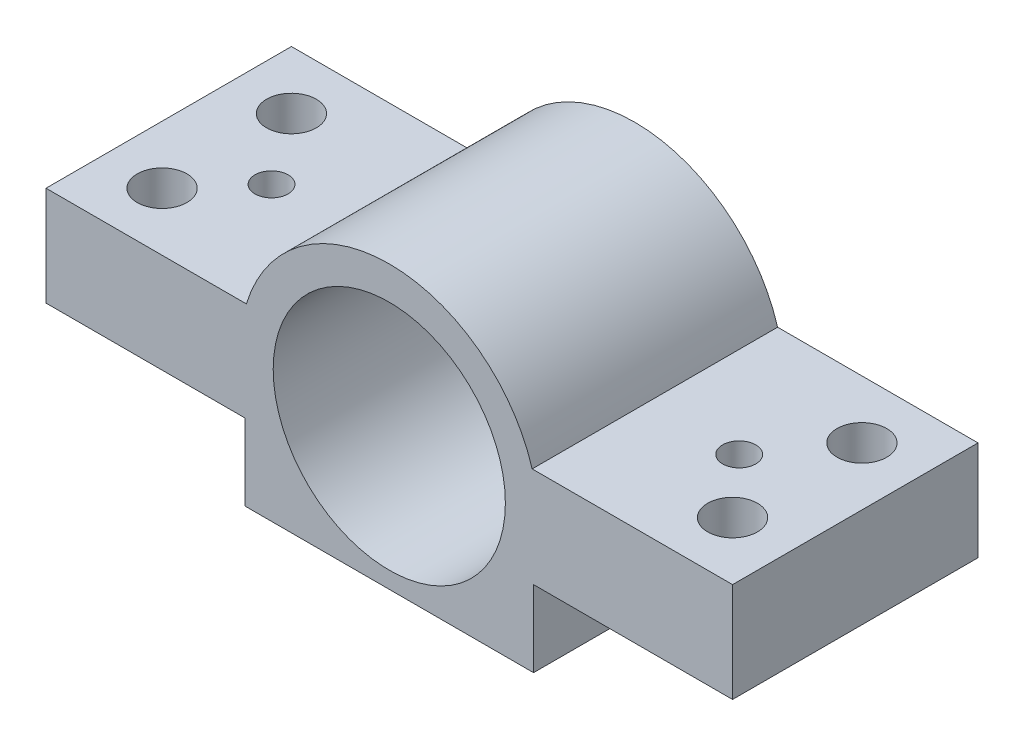
ISO-10303-21;
HEADER;
FILE_DESCRIPTION(('STEP AP214'),'2;1');
FILE_NAME('part.step','',(''),(''),'','','');
FILE_SCHEMA(('AUTOMOTIVE_DESIGN { 1 0 10303 214 1 1 1 1 }'));
ENDSEC;
DATA;
#1=APPLICATION_CONTEXT('core data for automotive mechanical design processes');
#2=APPLICATION_PROTOCOL_DEFINITION('international standard','automotive_design',2000,#1);
#3=PRODUCT_CONTEXT('',#1,'mechanical');
#4=PRODUCT('Part','Part','',(#3));
#5=PRODUCT_RELATED_PRODUCT_CATEGORY('part','',(#4));
#6=PRODUCT_DEFINITION_FORMATION('','',#4);
#7=PRODUCT_DEFINITION_CONTEXT('part definition',#1,'design');
#8=PRODUCT_DEFINITION('design','',#6,#7);
#9=PRODUCT_DEFINITION_SHAPE('','',#8);
#10=(LENGTH_UNIT() NAMED_UNIT(*) SI_UNIT(.MILLI.,.METRE.));
#11=(NAMED_UNIT(*) PLANE_ANGLE_UNIT() SI_UNIT($,.RADIAN.));
#12=(NAMED_UNIT(*) SI_UNIT($,.STERADIAN.) SOLID_ANGLE_UNIT());
#13=UNCERTAINTY_MEASURE_WITH_UNIT(LENGTH_MEASURE(1.E-05),#10,'distance_accuracy_value','');
#14=(GEOMETRIC_REPRESENTATION_CONTEXT(3) GLOBAL_UNCERTAINTY_ASSIGNED_CONTEXT((#13)) GLOBAL_UNIT_ASSIGNED_CONTEXT((#10,
#11,#12)) REPRESENTATION_CONTEXT('',''));
#15=CARTESIAN_POINT('',(0.,0.,0.));
#16=DIRECTION('',(0.,0.,1.));
#17=DIRECTION('',(1.,0.,0.));
#18=AXIS2_PLACEMENT_3D('',#15,#16,#17);
#19=CARTESIAN_POINT('',(0.,40.,74.));
#20=DIRECTION('',(0.,0.,-1.));
#21=DIRECTION('',(-1.,0.,0.));
#22=AXIS2_PLACEMENT_3D('',#19,#20,#21);
#23=CYLINDRICAL_SURFACE('',#22,35.);
#24=CARTESIAN_POINT('',(0.,40.,74.));
#25=DIRECTION('',(0.,0.,1.));
#26=DIRECTION('',(1.,0.,0.));
#27=AXIS2_PLACEMENT_3D('',#24,#25,#26);
#28=CIRCLE('',#27,35.);
#29=CARTESIAN_POINT('',(35.,40.,74.));
#30=VERTEX_POINT('',#29);
#31=EDGE_CURVE('E154',#30,#30,#28,.T.);
#32=ORIENTED_EDGE('',*,*,#31,.T.);
#33=EDGE_LOOP('',(#32));
#34=FACE_BOUND('',#33,.T.);
#35=CARTESIAN_POINT('',(0.,40.,13.));
#36=DIRECTION('',(0.,0.,-1.));
#37=DIRECTION('',(-1.,0.,0.));
#38=AXIS2_PLACEMENT_3D('',#35,#36,#37);
#39=CIRCLE('',#38,35.);
#40=CARTESIAN_POINT('',(-35.,40.,13.));
#41=VERTEX_POINT('',#40);
#42=EDGE_CURVE('E219',#41,#41,#39,.T.);
#43=ORIENTED_EDGE('',*,*,#42,.T.);
#44=EDGE_LOOP('',(#43));
#45=FACE_BOUND('',#44,.T.);
#46=ADVANCED_FACE('F40',(#34,#45),#23,.F.);
#47=CARTESIAN_POINT('',(0.,40.,74.));
#48=DIRECTION('',(0.,0.,1.));
#49=DIRECTION('',(1.,0.,0.));
#50=AXIS2_PLACEMENT_3D('',#47,#48,#49);
#51=PLANE('',#50);
#52=DIRECTION('',(-1.,0.,0.));
#53=VECTOR('',#52,1.);
#54=CARTESIAN_POINT('',(103.5,53.,74.));
#55=LINE('',#54,#53);
#56=CARTESIAN_POINT('',(103.5,53.,74.));
#57=VERTEX_POINT('',#56);
#58=CARTESIAN_POINT('',(43.081318457076,53.,74.));
#59=VERTEX_POINT('',#58);
#60=EDGE_CURVE('E169',#57,#59,#55,.T.);
#61=ORIENTED_EDGE('',*,*,#60,.T.);
#62=CARTESIAN_POINT('',(0.,40.,74.));
#63=DIRECTION('',(0.,0.,1.));
#64=DIRECTION('',(1.,0.,0.));
#65=AXIS2_PLACEMENT_3D('',#62,#63,#64);
#66=CIRCLE('',#65,45.);
#67=CARTESIAN_POINT('',(-43.081318457076,53.,74.));
#68=VERTEX_POINT('',#67);
#69=EDGE_CURVE('E106',#59,#68,#66,.T.);
#70=ORIENTED_EDGE('',*,*,#69,.T.);
#71=DIRECTION('',(-1.,0.,0.));
#72=VECTOR('',#71,1.);
#73=CARTESIAN_POINT('',(-103.5,53.,74.));
#74=LINE('',#73,#72);
#75=CARTESIAN_POINT('',(-103.5,53.,74.));
#76=VERTEX_POINT('',#75);
#77=EDGE_CURVE('E190',#68,#76,#74,.T.);
#78=ORIENTED_EDGE('',*,*,#77,.T.);
#79=DIRECTION('',(0.,-1.,0.));
#80=VECTOR('',#79,1.);
#81=CARTESIAN_POINT('',(-103.5,23.,74.));
#82=LINE('',#81,#80);
#83=CARTESIAN_POINT('',(-103.5,23.,74.));
#84=VERTEX_POINT('',#83);
#85=EDGE_CURVE('E209',#76,#84,#82,.T.);
#86=ORIENTED_EDGE('',*,*,#85,.T.);
#87=DIRECTION('',(1.,0.,0.));
#88=VECTOR('',#87,1.);
#89=CARTESIAN_POINT('',(-43.5,23.,74.));
#90=LINE('',#89,#88);
#91=CARTESIAN_POINT('',(-43.5,23.,74.));
#92=VERTEX_POINT('',#91);
#93=EDGE_CURVE('E206',#84,#92,#90,.T.);
#94=ORIENTED_EDGE('',*,*,#93,.T.);
#95=DIRECTION('',(0.,-1.,0.));
#96=VECTOR('',#95,1.);
#97=CARTESIAN_POINT('',(-43.5,0.,74.));
#98=LINE('',#97,#96);
#99=CARTESIAN_POINT('',(-43.5,0.,74.));
#100=VERTEX_POINT('',#99);
#101=EDGE_CURVE('E208',#92,#100,#98,.T.);
#102=ORIENTED_EDGE('',*,*,#101,.T.);
#103=DIRECTION('',(1.,0.,0.));
#104=VECTOR('',#103,1.);
#105=CARTESIAN_POINT('',(-43.5,0.,74.));
#106=LINE('',#105,#104);
#107=CARTESIAN_POINT('',(43.5,0.,74.));
#108=VERTEX_POINT('',#107);
#109=EDGE_CURVE('E132',#100,#108,#106,.T.);
#110=ORIENTED_EDGE('',*,*,#109,.T.);
#111=DIRECTION('',(0.,1.,0.));
#112=VECTOR('',#111,1.);
#113=CARTESIAN_POINT('',(43.5,0.,74.));
#114=LINE('',#113,#112);
#115=CARTESIAN_POINT('',(43.5,23.,74.));
#116=VERTEX_POINT('',#115);
#117=EDGE_CURVE('E125',#108,#116,#114,.T.);
#118=ORIENTED_EDGE('',*,*,#117,.T.);
#119=DIRECTION('',(1.,0.,0.));
#120=VECTOR('',#119,1.);
#121=CARTESIAN_POINT('',(43.5,23.,74.));
#122=LINE('',#121,#120);
#123=CARTESIAN_POINT('',(103.5,23.,74.));
#124=VERTEX_POINT('',#123);
#125=EDGE_CURVE('E130',#116,#124,#122,.T.);
#126=ORIENTED_EDGE('',*,*,#125,.T.);
#127=DIRECTION('',(0.,1.,0.));
#128=VECTOR('',#127,1.);
#129=CARTESIAN_POINT('',(103.5,23.,74.));
#130=LINE('',#129,#128);
#131=EDGE_CURVE('E57',#124,#57,#130,.T.);
#132=ORIENTED_EDGE('',*,*,#131,.T.);
#133=EDGE_LOOP('',(#61,#70,#78,#86,#94,#102,#110,#118,#126,#132));
#134=FACE_BOUND('',#133,.T.);
#135=ORIENTED_EDGE('',*,*,#31,.F.);
#136=EDGE_LOOP('',(#135));
#137=FACE_BOUND('',#136,.T.);
#138=ADVANCED_FACE('F127',(#134,#137),#51,.T.);
#139=CARTESIAN_POINT('',(0.,40.,0.));
#140=DIRECTION('',(0.,0.,1.));
#141=DIRECTION('',(1.,0.,0.));
#142=AXIS2_PLACEMENT_3D('',#139,#140,#141);
#143=PLANE('',#142);
#144=DIRECTION('',(-1.,0.,0.));
#145=VECTOR('',#144,1.);
#146=CARTESIAN_POINT('',(103.5,53.,0.));
#147=LINE('',#146,#145);
#148=CARTESIAN_POINT('',(103.5,53.,0.));
#149=VERTEX_POINT('',#148);
#150=CARTESIAN_POINT('',(43.081318457076,53.,0.));
#151=VERTEX_POINT('',#150);
#152=EDGE_CURVE('E150',#149,#151,#147,.T.);
#153=ORIENTED_EDGE('',*,*,#152,.F.);
#154=DIRECTION('',(0.,1.,0.));
#155=VECTOR('',#154,1.);
#156=CARTESIAN_POINT('',(103.5,23.,0.));
#157=LINE('',#156,#155);
#158=CARTESIAN_POINT('',(103.5,23.,0.));
#159=VERTEX_POINT('',#158);
#160=EDGE_CURVE('E98',#159,#149,#157,.T.);
#161=ORIENTED_EDGE('',*,*,#160,.F.);
#162=DIRECTION('',(1.,0.,0.));
#163=VECTOR('',#162,1.);
#164=CARTESIAN_POINT('',(43.5,23.,0.));
#165=LINE('',#164,#163);
#166=CARTESIAN_POINT('',(43.5,23.,0.));
#167=VERTEX_POINT('',#166);
#168=EDGE_CURVE('E92',#167,#159,#165,.T.);
#169=ORIENTED_EDGE('',*,*,#168,.F.);
#170=DIRECTION('',(0.,1.,0.));
#171=VECTOR('',#170,1.);
#172=CARTESIAN_POINT('',(43.5,0.,0.));
#173=LINE('',#172,#171);
#174=CARTESIAN_POINT('',(43.5,0.,0.));
#175=VERTEX_POINT('',#174);
#176=EDGE_CURVE('E140',#175,#167,#173,.T.);
#177=ORIENTED_EDGE('',*,*,#176,.F.);
#178=DIRECTION('',(1.,0.,0.));
#179=VECTOR('',#178,1.);
#180=CARTESIAN_POINT('',(-43.5,0.,0.));
#181=LINE('',#180,#179);
#182=CARTESIAN_POINT('',(-43.5,0.,0.));
#183=VERTEX_POINT('',#182);
#184=EDGE_CURVE('E164',#183,#175,#181,.T.);
#185=ORIENTED_EDGE('',*,*,#184,.F.);
#186=DIRECTION('',(0.,-1.,0.));
#187=VECTOR('',#186,1.);
#188=CARTESIAN_POINT('',(-43.5,0.,0.));
#189=LINE('',#188,#187);
#190=CARTESIAN_POINT('',(-43.5,23.,0.));
#191=VERTEX_POINT('',#190);
#192=EDGE_CURVE('E162',#191,#183,#189,.T.);
#193=ORIENTED_EDGE('',*,*,#192,.F.);
#194=DIRECTION('',(1.,0.,0.));
#195=VECTOR('',#194,1.);
#196=CARTESIAN_POINT('',(-43.5,23.,0.));
#197=LINE('',#196,#195);
#198=CARTESIAN_POINT('',(-103.5,23.,0.));
#199=VERTEX_POINT('',#198);
#200=EDGE_CURVE('E160',#199,#191,#197,.T.);
#201=ORIENTED_EDGE('',*,*,#200,.F.);
#202=DIRECTION('',(0.,-1.,0.));
#203=VECTOR('',#202,1.);
#204=CARTESIAN_POINT('',(-103.5,23.,0.));
#205=LINE('',#204,#203);
#206=CARTESIAN_POINT('',(-103.5,53.,0.));
#207=VERTEX_POINT('',#206);
#208=EDGE_CURVE('E158',#207,#199,#205,.T.);
#209=ORIENTED_EDGE('',*,*,#208,.F.);
#210=DIRECTION('',(-1.,0.,0.));
#211=VECTOR('',#210,1.);
#212=CARTESIAN_POINT('',(-103.5,53.,0.));
#213=LINE('',#212,#211);
#214=CARTESIAN_POINT('',(-43.081318457076,53.,0.));
#215=VERTEX_POINT('',#214);
#216=EDGE_CURVE('E156',#215,#207,#213,.T.);
#217=ORIENTED_EDGE('',*,*,#216,.F.);
#218=CARTESIAN_POINT('',(0.,40.,0.));
#219=DIRECTION('',(0.,0.,1.));
#220=DIRECTION('',(1.,0.,0.));
#221=AXIS2_PLACEMENT_3D('',#218,#219,#220);
#222=CIRCLE('',#221,45.);
#223=EDGE_CURVE('E153',#151,#215,#222,.T.);
#224=ORIENTED_EDGE('',*,*,#223,.F.);
#225=EDGE_LOOP('',(#153,#161,#169,#177,#185,#193,#201,#209,#217,#224));
#226=FACE_BOUND('',#225,.T.);
#227=CARTESIAN_POINT('',(0.,40.,0.));
#228=DIRECTION('',(0.,0.,-1.));
#229=DIRECTION('',(-1.,0.,0.));
#230=AXIS2_PLACEMENT_3D('',#227,#228,#229);
#231=CIRCLE('',#230,21.);
#232=CARTESIAN_POINT('',(-21.,40.,0.));
#233=VERTEX_POINT('',#232);
#234=EDGE_CURVE('E223',#233,#233,#231,.T.);
#235=ORIENTED_EDGE('',*,*,#234,.F.);
#236=EDGE_LOOP('',(#235));
#237=FACE_BOUND('',#236,.T.);
#238=ADVANCED_FACE('F194',(#226,#237),#143,.F.);
#239=CARTESIAN_POINT('',(103.5,53.,74.));
#240=DIRECTION('',(0.,-1.,0.));
#241=DIRECTION('',(0.,0.,-1.));
#242=AXIS2_PLACEMENT_3D('',#239,#240,#241);
#243=PLANE('',#242);
#244=CARTESIAN_POINT('',(86.,53.,56.5000000000002));
#245=DIRECTION('',(0.,-1.,0.));
#246=DIRECTION('',(0.,0.,-1.));
#247=AXIS2_PLACEMENT_3D('',#244,#245,#246);
#248=CIRCLE('',#247,7.49999999999993);
#249=CARTESIAN_POINT('',(86.,53.,49.0000000000003));
#250=VERTEX_POINT('',#249);
#251=EDGE_CURVE('E238',#250,#250,#248,.F.);
#252=ORIENTED_EDGE('',*,*,#251,.F.);
#253=EDGE_LOOP('',(#252));
#254=FACE_BOUND('',#253,.T.);
#255=CARTESIAN_POINT('',(70.5,53.,39.0000000000001));
#256=DIRECTION('',(0.,-1.,0.));
#257=DIRECTION('',(0.,0.,-1.));
#258=AXIS2_PLACEMENT_3D('',#255,#256,#257);
#259=CIRCLE('',#258,4.99999999999983);
#260=CARTESIAN_POINT('',(70.5,53.,34.0000000000003));
#261=VERTEX_POINT('',#260);
#262=EDGE_CURVE('E239',#261,#261,#259,.F.);
#263=ORIENTED_EDGE('',*,*,#262,.F.);
#264=EDGE_LOOP('',(#263));
#265=FACE_BOUND('',#264,.T.);
#266=CARTESIAN_POINT('',(86.,53.,17.5000000000001));
#267=DIRECTION('',(0.,-1.,0.));
#268=DIRECTION('',(0.,0.,-1.));
#269=AXIS2_PLACEMENT_3D('',#266,#267,#268);
#270=CIRCLE('',#269,7.49999999999981);
#271=CARTESIAN_POINT('',(86.,53.,10.0000000000003));
#272=VERTEX_POINT('',#271);
#273=EDGE_CURVE('E261',#272,#272,#270,.F.);
#274=ORIENTED_EDGE('',*,*,#273,.F.);
#275=EDGE_LOOP('',(#274));
#276=FACE_BOUND('',#275,.T.);
#277=ORIENTED_EDGE('',*,*,#152,.T.);
#278=DIRECTION('',(0.,0.,-1.));
#279=VECTOR('',#278,1.);
#280=CARTESIAN_POINT('',(43.081318457076,53.,74.));
#281=LINE('',#280,#279);
#282=EDGE_CURVE('E11',#59,#151,#281,.T.);
#283=ORIENTED_EDGE('',*,*,#282,.F.);
#284=ORIENTED_EDGE('',*,*,#60,.F.);
#285=DIRECTION('',(0.,0.,-1.));
#286=VECTOR('',#285,1.);
#287=CARTESIAN_POINT('',(103.5,53.,74.));
#288=LINE('',#287,#286);
#289=EDGE_CURVE('E146',#57,#149,#288,.T.);
#290=ORIENTED_EDGE('',*,*,#289,.T.);
#291=EDGE_LOOP('',(#277,#283,#284,#290));
#292=FACE_BOUND('',#291,.T.);
#293=ADVANCED_FACE('F42',(#254,#265,#276,#292),#243,.F.);
#294=CARTESIAN_POINT('',(0.,40.,74.));
#295=DIRECTION('',(0.,0.,-1.));
#296=DIRECTION('',(-1.,0.,0.));
#297=AXIS2_PLACEMENT_3D('',#294,#295,#296);
#298=CYLINDRICAL_SURFACE('',#297,45.);
#299=ORIENTED_EDGE('',*,*,#223,.T.);
#300=DIRECTION('',(0.,0.,-1.));
#301=VECTOR('',#300,1.);
#302=CARTESIAN_POINT('',(-43.081318457076,53.,74.));
#303=LINE('',#302,#301);
#304=EDGE_CURVE('E49',#68,#215,#303,.T.);
#305=ORIENTED_EDGE('',*,*,#304,.F.);
#306=ORIENTED_EDGE('',*,*,#69,.F.);
#307=ORIENTED_EDGE('',*,*,#282,.T.);
#308=EDGE_LOOP('',(#299,#305,#306,#307));
#309=FACE_BOUND('',#308,.T.);
#310=ADVANCED_FACE('F270',(#309),#298,.T.);
#311=CARTESIAN_POINT('',(-103.5,53.,74.));
#312=DIRECTION('',(0.,-1.,0.));
#313=DIRECTION('',(0.,0.,-1.));
#314=AXIS2_PLACEMENT_3D('',#311,#312,#313);
#315=PLANE('',#314);
#316=CARTESIAN_POINT('',(-70.5,53.,39.0000000000001));
#317=DIRECTION('',(0.,-1.,0.));
#318=DIRECTION('',(0.,0.,-1.));
#319=AXIS2_PLACEMENT_3D('',#316,#317,#318);
#320=CIRCLE('',#319,4.99999999999982);
#321=CARTESIAN_POINT('',(-70.5,53.,34.0000000000003));
#322=VERTEX_POINT('',#321);
#323=EDGE_CURVE('E252',#322,#322,#320,.F.);
#324=ORIENTED_EDGE('',*,*,#323,.F.);
#325=EDGE_LOOP('',(#324));
#326=FACE_BOUND('',#325,.T.);
#327=CARTESIAN_POINT('',(-86.,53.,17.5000000000001));
#328=DIRECTION('',(0.,-1.,0.));
#329=DIRECTION('',(0.,0.,-1.));
#330=AXIS2_PLACEMENT_3D('',#327,#328,#329);
#331=CIRCLE('',#330,7.49999999999988);
#332=CARTESIAN_POINT('',(-86.,53.,10.0000000000002));
#333=VERTEX_POINT('',#332);
#334=EDGE_CURVE('E246',#333,#333,#331,.F.);
#335=ORIENTED_EDGE('',*,*,#334,.F.);
#336=EDGE_LOOP('',(#335));
#337=FACE_BOUND('',#336,.T.);
#338=CARTESIAN_POINT('',(-86.,53.,56.5000000000002));
#339=DIRECTION('',(0.,-1.,0.));
#340=DIRECTION('',(0.,0.,-1.));
#341=AXIS2_PLACEMENT_3D('',#338,#339,#340);
#342=CIRCLE('',#341,7.49999999999988);
#343=CARTESIAN_POINT('',(-86.,53.,49.0000000000003));
#344=VERTEX_POINT('',#343);
#345=EDGE_CURVE('E226',#344,#344,#342,.F.);
#346=ORIENTED_EDGE('',*,*,#345,.F.);
#347=EDGE_LOOP('',(#346));
#348=FACE_BOUND('',#347,.T.);
#349=ORIENTED_EDGE('',*,*,#216,.T.);
#350=DIRECTION('',(0.,0.,-1.));
#351=VECTOR('',#350,1.);
#352=CARTESIAN_POINT('',(-103.5,53.,74.));
#353=LINE('',#352,#351);
#354=EDGE_CURVE('E182',#76,#207,#353,.T.);
#355=ORIENTED_EDGE('',*,*,#354,.F.);
#356=ORIENTED_EDGE('',*,*,#77,.F.);
#357=ORIENTED_EDGE('',*,*,#304,.T.);
#358=EDGE_LOOP('',(#349,#355,#356,#357));
#359=FACE_BOUND('',#358,.T.);
#360=ADVANCED_FACE('F188',(#326,#337,#348,#359),#315,.F.);
#361=CARTESIAN_POINT('',(-103.5,23.,74.));
#362=DIRECTION('',(1.,0.,0.));
#363=DIRECTION('',(0.,0.,-1.));
#364=AXIS2_PLACEMENT_3D('',#361,#362,#363);
#365=PLANE('',#364);
#366=ORIENTED_EDGE('',*,*,#208,.T.);
#367=DIRECTION('',(0.,0.,-1.));
#368=VECTOR('',#367,1.);
#369=CARTESIAN_POINT('',(-103.5,23.,74.));
#370=LINE('',#369,#368);
#371=EDGE_CURVE('E179',#84,#199,#370,.T.);
#372=ORIENTED_EDGE('',*,*,#371,.F.);
#373=ORIENTED_EDGE('',*,*,#85,.F.);
#374=ORIENTED_EDGE('',*,*,#354,.T.);
#375=EDGE_LOOP('',(#366,#372,#373,#374));
#376=FACE_BOUND('',#375,.T.);
#377=ADVANCED_FACE('F200',(#376),#365,.F.);
#378=CARTESIAN_POINT('',(-43.5,23.,74.));
#379=DIRECTION('',(0.,1.,0.));
#380=DIRECTION('',(-1.,0.,0.));
#381=AXIS2_PLACEMENT_3D('',#378,#379,#380);
#382=PLANE('',#381);
#383=CARTESIAN_POINT('',(-70.5,23.,39.0000000000001));
#384=DIRECTION('',(0.,-1.,0.));
#385=DIRECTION('',(0.,0.,-1.));
#386=AXIS2_PLACEMENT_3D('',#383,#384,#385);
#387=CIRCLE('',#386,4.99999999999982);
#388=CARTESIAN_POINT('',(-70.5,23.,34.0000000000003));
#389=VERTEX_POINT('',#388);
#390=EDGE_CURVE('E234',#389,#389,#387,.T.);
#391=ORIENTED_EDGE('',*,*,#390,.F.);
#392=EDGE_LOOP('',(#391));
#393=FACE_BOUND('',#392,.T.);
#394=CARTESIAN_POINT('',(-86.,23.,17.5000000000001));
#395=DIRECTION('',(0.,-1.,0.));
#396=DIRECTION('',(0.,0.,-1.));
#397=AXIS2_PLACEMENT_3D('',#394,#395,#396);
#398=CIRCLE('',#397,7.49999999999988);
#399=CARTESIAN_POINT('',(-86.,23.,10.0000000000002));
#400=VERTEX_POINT('',#399);
#401=EDGE_CURVE('E249',#400,#400,#398,.T.);
#402=ORIENTED_EDGE('',*,*,#401,.F.);
#403=EDGE_LOOP('',(#402));
#404=FACE_BOUND('',#403,.T.);
#405=CARTESIAN_POINT('',(-86.,23.,56.5000000000002));
#406=DIRECTION('',(0.,-1.,0.));
#407=DIRECTION('',(0.,0.,-1.));
#408=AXIS2_PLACEMENT_3D('',#405,#406,#407);
#409=CIRCLE('',#408,7.49999999999988);
#410=CARTESIAN_POINT('',(-86.,23.,49.0000000000003));
#411=VERTEX_POINT('',#410);
#412=EDGE_CURVE('E231',#411,#411,#409,.T.);
#413=ORIENTED_EDGE('',*,*,#412,.F.);
#414=EDGE_LOOP('',(#413));
#415=FACE_BOUND('',#414,.T.);
#416=ORIENTED_EDGE('',*,*,#200,.T.);
#417=DIRECTION('',(0.,0.,-1.));
#418=VECTOR('',#417,1.);
#419=CARTESIAN_POINT('',(-43.5,23.,74.));
#420=LINE('',#419,#418);
#421=EDGE_CURVE('E176',#92,#191,#420,.T.);
#422=ORIENTED_EDGE('',*,*,#421,.F.);
#423=ORIENTED_EDGE('',*,*,#93,.F.);
#424=ORIENTED_EDGE('',*,*,#371,.T.);
#425=EDGE_LOOP('',(#416,#422,#423,#424));
#426=FACE_BOUND('',#425,.T.);
#427=ADVANCED_FACE('F204',(#393,#404,#415,#426),#382,.F.);
#428=CARTESIAN_POINT('',(-43.5,0.,74.));
#429=DIRECTION('',(1.,0.,0.));
#430=DIRECTION('',(0.,0.,-1.));
#431=AXIS2_PLACEMENT_3D('',#428,#429,#430);
#432=PLANE('',#431);
#433=ORIENTED_EDGE('',*,*,#192,.T.);
#434=DIRECTION('',(0.,0.,-1.));
#435=VECTOR('',#434,1.);
#436=CARTESIAN_POINT('',(-43.5,0.,74.));
#437=LINE('',#436,#435);
#438=EDGE_CURVE('E173',#100,#183,#437,.T.);
#439=ORIENTED_EDGE('',*,*,#438,.F.);
#440=ORIENTED_EDGE('',*,*,#101,.F.);
#441=ORIENTED_EDGE('',*,*,#421,.T.);
#442=EDGE_LOOP('',(#433,#439,#440,#441));
#443=FACE_BOUND('',#442,.T.);
#444=ADVANCED_FACE('F279',(#443),#432,.F.);
#445=CARTESIAN_POINT('',(-43.5,0.,74.));
#446=DIRECTION('',(0.,1.,0.));
#447=DIRECTION('',(-1.,0.,0.));
#448=AXIS2_PLACEMENT_3D('',#445,#446,#447);
#449=PLANE('',#448);
#450=ORIENTED_EDGE('',*,*,#184,.T.);
#451=DIRECTION('',(0.,0.,-1.));
#452=VECTOR('',#451,1.);
#453=CARTESIAN_POINT('',(43.5,0.,74.));
#454=LINE('',#453,#452);
#455=EDGE_CURVE('E141',#108,#175,#454,.T.);
#456=ORIENTED_EDGE('',*,*,#455,.F.);
#457=ORIENTED_EDGE('',*,*,#109,.F.);
#458=ORIENTED_EDGE('',*,*,#438,.T.);
#459=EDGE_LOOP('',(#450,#456,#457,#458));
#460=FACE_BOUND('',#459,.T.);
#461=ADVANCED_FACE('F276',(#460),#449,.F.);
#462=CARTESIAN_POINT('',(43.5,0.,74.));
#463=DIRECTION('',(-1.,0.,0.));
#464=DIRECTION('',(0.,0.,1.));
#465=AXIS2_PLACEMENT_3D('',#462,#463,#464);
#466=PLANE('',#465);
#467=ORIENTED_EDGE('',*,*,#176,.T.);
#468=DIRECTION('',(0.,0.,-1.));
#469=VECTOR('',#468,1.);
#470=CARTESIAN_POINT('',(43.5,23.,74.));
#471=LINE('',#470,#469);
#472=EDGE_CURVE('E137',#116,#167,#471,.T.);
#473=ORIENTED_EDGE('',*,*,#472,.F.);
#474=ORIENTED_EDGE('',*,*,#117,.F.);
#475=ORIENTED_EDGE('',*,*,#455,.T.);
#476=EDGE_LOOP('',(#467,#473,#474,#475));
#477=FACE_BOUND('',#476,.T.);
#478=ADVANCED_FACE('F138',(#477),#466,.F.);
#479=CARTESIAN_POINT('',(43.5,23.,74.));
#480=DIRECTION('',(0.,1.,0.));
#481=DIRECTION('',(0.,0.,1.));
#482=AXIS2_PLACEMENT_3D('',#479,#480,#481);
#483=PLANE('',#482);
#484=CARTESIAN_POINT('',(86.,23.,56.5000000000002));
#485=DIRECTION('',(0.,-1.,0.));
#486=DIRECTION('',(0.,0.,-1.));
#487=AXIS2_PLACEMENT_3D('',#484,#485,#486);
#488=CIRCLE('',#487,7.49999999999993);
#489=CARTESIAN_POINT('',(86.,23.,49.0000000000003));
#490=VERTEX_POINT('',#489);
#491=EDGE_CURVE('E243',#490,#490,#488,.T.);
#492=ORIENTED_EDGE('',*,*,#491,.F.);
#493=EDGE_LOOP('',(#492));
#494=FACE_BOUND('',#493,.T.);
#495=CARTESIAN_POINT('',(70.5,23.,39.0000000000001));
#496=DIRECTION('',(0.,-1.,0.));
#497=DIRECTION('',(0.,0.,-1.));
#498=AXIS2_PLACEMENT_3D('',#495,#496,#497);
#499=CIRCLE('',#498,4.99999999999983);
#500=CARTESIAN_POINT('',(70.5,23.,34.0000000000003));
#501=VERTEX_POINT('',#500);
#502=EDGE_CURVE('E235',#501,#501,#499,.T.);
#503=ORIENTED_EDGE('',*,*,#502,.F.);
#504=EDGE_LOOP('',(#503));
#505=FACE_BOUND('',#504,.T.);
#506=CARTESIAN_POINT('',(86.,23.,17.5000000000001));
#507=DIRECTION('',(0.,-1.,0.));
#508=DIRECTION('',(0.,0.,-1.));
#509=AXIS2_PLACEMENT_3D('',#506,#507,#508);
#510=CIRCLE('',#509,7.49999999999981);
#511=CARTESIAN_POINT('',(86.,23.,10.0000000000003));
#512=VERTEX_POINT('',#511);
#513=EDGE_CURVE('E242',#512,#512,#510,.T.);
#514=ORIENTED_EDGE('',*,*,#513,.F.);
#515=EDGE_LOOP('',(#514));
#516=FACE_BOUND('',#515,.T.);
#517=ORIENTED_EDGE('',*,*,#168,.T.);
#518=DIRECTION('',(0.,0.,-1.));
#519=VECTOR('',#518,1.);
#520=CARTESIAN_POINT('',(103.5,23.,74.));
#521=LINE('',#520,#519);
#522=EDGE_CURVE('E142',#124,#159,#521,.T.);
#523=ORIENTED_EDGE('',*,*,#522,.F.);
#524=ORIENTED_EDGE('',*,*,#125,.F.);
#525=ORIENTED_EDGE('',*,*,#472,.T.);
#526=EDGE_LOOP('',(#517,#523,#524,#525));
#527=FACE_BOUND('',#526,.T.);
#528=ADVANCED_FACE('F144',(#494,#505,#516,#527),#483,.F.);
#529=CARTESIAN_POINT('',(103.5,23.,74.));
#530=DIRECTION('',(-1.,0.,0.));
#531=DIRECTION('',(0.,0.,1.));
#532=AXIS2_PLACEMENT_3D('',#529,#530,#531);
#533=PLANE('',#532);
#534=ORIENTED_EDGE('',*,*,#160,.T.);
#535=ORIENTED_EDGE('',*,*,#289,.F.);
#536=ORIENTED_EDGE('',*,*,#131,.F.);
#537=ORIENTED_EDGE('',*,*,#522,.T.);
#538=EDGE_LOOP('',(#534,#535,#536,#537));
#539=FACE_BOUND('',#538,.T.);
#540=ADVANCED_FACE('F303',(#539),#533,.F.);
#541=CARTESIAN_POINT('',(0.,40.,13.));
#542=DIRECTION('',(0.,0.,-1.));
#543=DIRECTION('',(-1.,0.,0.));
#544=AXIS2_PLACEMENT_3D('',#541,#542,#543);
#545=PLANE('',#544);
#546=CARTESIAN_POINT('',(0.,40.,13.));
#547=DIRECTION('',(0.,0.,-1.));
#548=DIRECTION('',(-1.,0.,0.));
#549=AXIS2_PLACEMENT_3D('',#546,#547,#548);
#550=CIRCLE('',#549,21.);
#551=CARTESIAN_POINT('',(-21.,40.,13.));
#552=VERTEX_POINT('',#551);
#553=EDGE_CURVE('E222',#552,#552,#550,.T.);
#554=ORIENTED_EDGE('',*,*,#553,.T.);
#555=EDGE_LOOP('',(#554));
#556=FACE_BOUND('',#555,.T.);
#557=ORIENTED_EDGE('',*,*,#42,.F.);
#558=EDGE_LOOP('',(#557));
#559=FACE_BOUND('',#558,.T.);
#560=ADVANCED_FACE('F298',(#556,#559),#545,.F.);
#561=CARTESIAN_POINT('',(0.,40.,13.));
#562=DIRECTION('',(0.,0.,-1.));
#563=DIRECTION('',(-1.,0.,0.));
#564=AXIS2_PLACEMENT_3D('',#561,#562,#563);
#565=CYLINDRICAL_SURFACE('',#564,21.);
#566=ORIENTED_EDGE('',*,*,#553,.F.);
#567=EDGE_LOOP('',(#566));
#568=FACE_BOUND('',#567,.T.);
#569=ORIENTED_EDGE('',*,*,#234,.T.);
#570=EDGE_LOOP('',(#569));
#571=FACE_BOUND('',#570,.T.);
#572=ADVANCED_FACE('F330',(#568,#571),#565,.F.);
#573=CARTESIAN_POINT('',(86.,74.2132034355962,17.5000000000001));
#574=DIRECTION('',(0.,-1.,0.));
#575=DIRECTION('',(0.,0.,-1.));
#576=AXIS2_PLACEMENT_3D('',#573,#574,#575);
#577=CYLINDRICAL_SURFACE('',#576,7.49999999999981);
#578=ORIENTED_EDGE('',*,*,#273,.T.);
#579=EDGE_LOOP('',(#578));
#580=FACE_BOUND('',#579,.T.);
#581=ORIENTED_EDGE('',*,*,#513,.T.);
#582=EDGE_LOOP('',(#581));
#583=FACE_BOUND('',#582,.T.);
#584=ADVANCED_FACE('F265',(#580,#583),#577,.F.);
#585=CARTESIAN_POINT('',(70.5,74.2132034355962,39.0000000000001));
#586=DIRECTION('',(0.,-1.,0.));
#587=DIRECTION('',(0.,0.,-1.));
#588=AXIS2_PLACEMENT_3D('',#585,#586,#587);
#589=CYLINDRICAL_SURFACE('',#588,4.99999999999983);
#590=ORIENTED_EDGE('',*,*,#262,.T.);
#591=EDGE_LOOP('',(#590));
#592=FACE_BOUND('',#591,.T.);
#593=ORIENTED_EDGE('',*,*,#502,.T.);
#594=EDGE_LOOP('',(#593));
#595=FACE_BOUND('',#594,.T.);
#596=ADVANCED_FACE('F344',(#592,#595),#589,.F.);
#597=CARTESIAN_POINT('',(86.,74.2132034355962,56.5000000000002));
#598=DIRECTION('',(0.,-1.,0.));
#599=DIRECTION('',(0.,0.,-1.));
#600=AXIS2_PLACEMENT_3D('',#597,#598,#599);
#601=CYLINDRICAL_SURFACE('',#600,7.49999999999993);
#602=ORIENTED_EDGE('',*,*,#251,.T.);
#603=EDGE_LOOP('',(#602));
#604=FACE_BOUND('',#603,.T.);
#605=ORIENTED_EDGE('',*,*,#491,.T.);
#606=EDGE_LOOP('',(#605));
#607=FACE_BOUND('',#606,.T.);
#608=ADVANCED_FACE('F351',(#604,#607),#601,.F.);
#609=CARTESIAN_POINT('',(-86.,74.2132034355962,56.5000000000002));
#610=DIRECTION('',(0.,-1.,0.));
#611=DIRECTION('',(0.,0.,-1.));
#612=AXIS2_PLACEMENT_3D('',#609,#610,#611);
#613=CYLINDRICAL_SURFACE('',#612,7.49999999999988);
#614=ORIENTED_EDGE('',*,*,#345,.T.);
#615=EDGE_LOOP('',(#614));
#616=FACE_BOUND('',#615,.T.);
#617=ORIENTED_EDGE('',*,*,#412,.T.);
#618=EDGE_LOOP('',(#617));
#619=FACE_BOUND('',#618,.T.);
#620=ADVANCED_FACE('F359',(#616,#619),#613,.F.);
#621=CARTESIAN_POINT('',(-86.,74.2132034355962,17.5000000000001));
#622=DIRECTION('',(0.,-1.,0.));
#623=DIRECTION('',(0.,0.,-1.));
#624=AXIS2_PLACEMENT_3D('',#621,#622,#623);
#625=CYLINDRICAL_SURFACE('',#624,7.49999999999988);
#626=ORIENTED_EDGE('',*,*,#334,.T.);
#627=EDGE_LOOP('',(#626));
#628=FACE_BOUND('',#627,.T.);
#629=ORIENTED_EDGE('',*,*,#401,.T.);
#630=EDGE_LOOP('',(#629));
#631=FACE_BOUND('',#630,.T.);
#632=ADVANCED_FACE('F367',(#628,#631),#625,.F.);
#633=CARTESIAN_POINT('',(-70.5,74.2132034355962,39.0000000000001));
#634=DIRECTION('',(0.,-1.,0.));
#635=DIRECTION('',(0.,0.,-1.));
#636=AXIS2_PLACEMENT_3D('',#633,#634,#635);
#637=CYLINDRICAL_SURFACE('',#636,4.99999999999982);
#638=ORIENTED_EDGE('',*,*,#323,.T.);
#639=EDGE_LOOP('',(#638));
#640=FACE_BOUND('',#639,.T.);
#641=ORIENTED_EDGE('',*,*,#390,.T.);
#642=EDGE_LOOP('',(#641));
#643=FACE_BOUND('',#642,.T.);
#644=ADVANCED_FACE('F375',(#640,#643),#637,.F.);
#645=CLOSED_SHELL('',(#46,#138,#238,#293,#310,#360,#377,#427,#444,#461,#478,#528,#540,#560,#572,
#584,#596,#608,#620,#632,#644));
#646=MANIFOLD_SOLID_BREP('B2',#645);
#647=ADVANCED_BREP_SHAPE_REPRESENTATION('',(#18,#646),#14);
#648=SHAPE_DEFINITION_REPRESENTATION(#9,#647);
ENDSEC;
END-ISO-10303-21;
